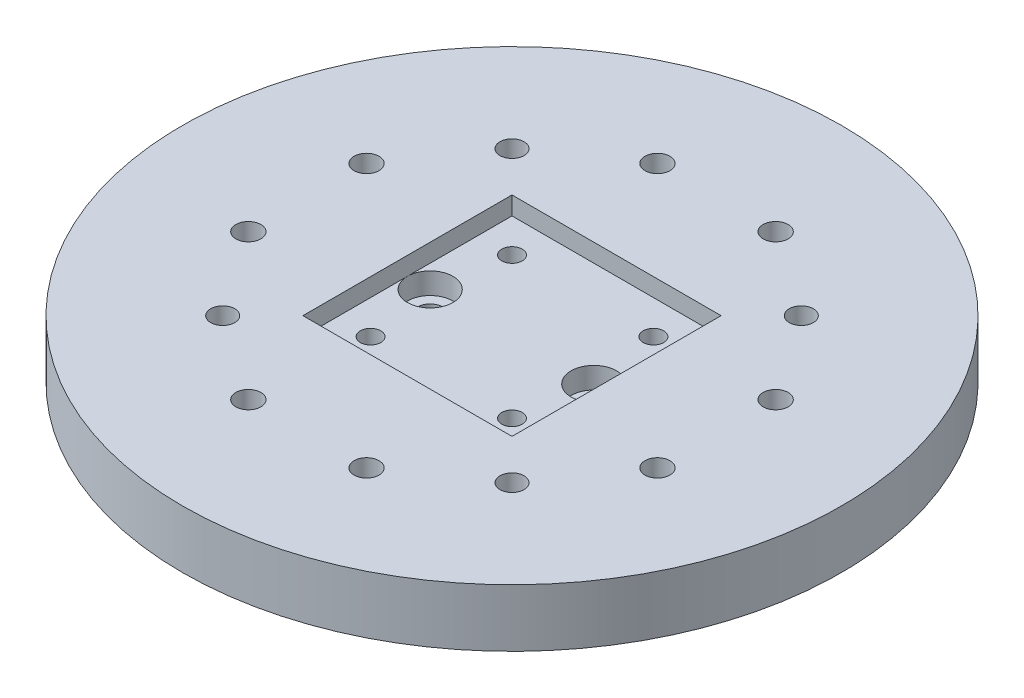
ISO-10303-21;
HEADER;
FILE_DESCRIPTION(('STEP AP214'),'2;1');
FILE_NAME('part.step','',(''),(''),'','','');
FILE_SCHEMA(('AUTOMOTIVE_DESIGN { 1 0 10303 214 1 1 1 1 }'));
ENDSEC;
DATA;
#1=APPLICATION_CONTEXT('core data for automotive mechanical design processes');
#2=APPLICATION_PROTOCOL_DEFINITION('international standard','automotive_design',2000,#1);
#3=PRODUCT_CONTEXT('',#1,'mechanical');
#4=PRODUCT('Part','Part','',(#3));
#5=PRODUCT_RELATED_PRODUCT_CATEGORY('part','',(#4));
#6=PRODUCT_DEFINITION_FORMATION('','',#4);
#7=PRODUCT_DEFINITION_CONTEXT('part definition',#1,'design');
#8=PRODUCT_DEFINITION('design','',#6,#7);
#9=PRODUCT_DEFINITION_SHAPE('','',#8);
#10=(LENGTH_UNIT() NAMED_UNIT(*) SI_UNIT(.MILLI.,.METRE.));
#11=(NAMED_UNIT(*) PLANE_ANGLE_UNIT() SI_UNIT($,.RADIAN.));
#12=(NAMED_UNIT(*) SI_UNIT($,.STERADIAN.) SOLID_ANGLE_UNIT());
#13=UNCERTAINTY_MEASURE_WITH_UNIT(LENGTH_MEASURE(1.E-05),#10,'distance_accuracy_value','');
#14=(GEOMETRIC_REPRESENTATION_CONTEXT(3) GLOBAL_UNCERTAINTY_ASSIGNED_CONTEXT((#13)) GLOBAL_UNIT_ASSIGNED_CONTEXT((#10,
#11,#12)) REPRESENTATION_CONTEXT('',''));
#15=CARTESIAN_POINT('',(0.,0.,0.));
#16=DIRECTION('',(0.,0.,1.));
#17=DIRECTION('',(1.,0.,0.));
#18=AXIS2_PLACEMENT_3D('',#15,#16,#17);
#19=CARTESIAN_POINT('',(-18.,12.7,0.));
#20=DIRECTION('',(0.,-1.,0.));
#21=DIRECTION('',(0.,0.,-1.));
#22=AXIS2_PLACEMENT_3D('',#19,#20,#21);
#23=CYLINDRICAL_SURFACE('',#22,2.75);
#24=CARTESIAN_POINT('',(-18.,0.,0.));
#25=DIRECTION('',(0.,-1.,0.));
#26=DIRECTION('',(0.,0.,1.));
#27=AXIS2_PLACEMENT_3D('',#24,#25,#26);
#28=CIRCLE('',#27,2.75);
#29=CARTESIAN_POINT('',(-18.,0.,2.75));
#30=VERTEX_POINT('',#29);
#31=EDGE_CURVE('E242',#30,#30,#28,.T.);
#32=ORIENTED_EDGE('',*,*,#31,.T.);
#33=EDGE_LOOP('',(#32));
#34=FACE_BOUND('',#33,.T.);
#35=CARTESIAN_POINT('',(-18.,4.,0.));
#36=DIRECTION('',(0.,1.,0.));
#37=DIRECTION('',(0.,0.,1.));
#38=AXIS2_PLACEMENT_3D('',#35,#36,#37);
#39=CIRCLE('',#38,2.75);
#40=CARTESIAN_POINT('',(-18.,4.,2.75));
#41=VERTEX_POINT('',#40);
#42=EDGE_CURVE('E49',#41,#41,#39,.F.);
#43=ORIENTED_EDGE('',*,*,#42,.F.);
#44=EDGE_LOOP('',(#43));
#45=FACE_BOUND('',#44,.T.);
#46=ADVANCED_FACE('F45',(#34,#45),#23,.F.);
#47=CARTESIAN_POINT('',(18.,12.7,0.));
#48=DIRECTION('',(0.,-1.,0.));
#49=DIRECTION('',(0.,0.,-1.));
#50=AXIS2_PLACEMENT_3D('',#47,#48,#49);
#51=CYLINDRICAL_SURFACE('',#50,2.75);
#52=CARTESIAN_POINT('',(18.,0.,0.));
#53=DIRECTION('',(0.,-1.,0.));
#54=DIRECTION('',(0.,0.,-1.));
#55=AXIS2_PLACEMENT_3D('',#52,#53,#54);
#56=CIRCLE('',#55,2.75);
#57=CARTESIAN_POINT('',(18.,0.,-2.75));
#58=VERTEX_POINT('',#57);
#59=EDGE_CURVE('E253',#58,#58,#56,.T.);
#60=ORIENTED_EDGE('',*,*,#59,.T.);
#61=EDGE_LOOP('',(#60));
#62=FACE_BOUND('',#61,.T.);
#63=CARTESIAN_POINT('',(18.,4.,0.));
#64=DIRECTION('',(0.,1.,0.));
#65=DIRECTION('',(0.,0.,1.));
#66=AXIS2_PLACEMENT_3D('',#63,#64,#65);
#67=CIRCLE('',#66,2.75);
#68=CARTESIAN_POINT('',(18.,4.,2.75));
#69=VERTEX_POINT('',#68);
#70=EDGE_CURVE('E236',#69,#69,#67,.F.);
#71=ORIENTED_EDGE('',*,*,#70,.F.);
#72=EDGE_LOOP('',(#71));
#73=FACE_BOUND('',#72,.T.);
#74=ADVANCED_FACE('F299',(#62,#73),#51,.F.);
#75=CARTESIAN_POINT('',(31.8198051533945,12.7,31.8198051533948));
#76=DIRECTION('',(0.,-1.,0.));
#77=DIRECTION('',(0.,0.,-1.));
#78=AXIS2_PLACEMENT_3D('',#75,#76,#77);
#79=CYLINDRICAL_SURFACE('',#78,2.65);
#80=CARTESIAN_POINT('',(31.8198051533945,12.7,31.8198051533948));
#81=DIRECTION('',(0.,-1.,0.));
#82=DIRECTION('',(0.,0.,-1.));
#83=AXIS2_PLACEMENT_3D('',#80,#81,#82);
#84=CIRCLE('',#83,2.65);
#85=CARTESIAN_POINT('',(31.8198051533945,12.7,29.1698051533948));
#86=VERTEX_POINT('',#85);
#87=EDGE_CURVE('E215',#86,#86,#84,.T.);
#88=ORIENTED_EDGE('',*,*,#87,.F.);
#89=EDGE_LOOP('',(#88));
#90=FACE_BOUND('',#89,.T.);
#91=CARTESIAN_POINT('',(31.8198051533945,5.,31.8198051533948));
#92=DIRECTION('',(0.,-1.,0.));
#93=DIRECTION('',(0.,0.,-1.));
#94=AXIS2_PLACEMENT_3D('',#91,#92,#93);
#95=CIRCLE('',#94,2.65);
#96=CARTESIAN_POINT('',(31.8198051533945,5.,29.1698051533948));
#97=VERTEX_POINT('',#96);
#98=EDGE_CURVE('E222',#97,#97,#95,.F.);
#99=ORIENTED_EDGE('',*,*,#98,.F.);
#100=EDGE_LOOP('',(#99));
#101=FACE_BOUND('',#100,.T.);
#102=ADVANCED_FACE('F305',(#90,#101),#79,.F.);
#103=CARTESIAN_POINT('',(31.8198051533948,12.7,-31.8198051533944));
#104=DIRECTION('',(0.,-1.,0.));
#105=DIRECTION('',(0.,0.,-1.));
#106=AXIS2_PLACEMENT_3D('',#103,#104,#105);
#107=CYLINDRICAL_SURFACE('',#106,2.65000000000009);
#108=CARTESIAN_POINT('',(31.8198051533948,12.7,-31.8198051533944));
#109=DIRECTION('',(0.,-1.,0.));
#110=DIRECTION('',(0.,0.,-1.));
#111=AXIS2_PLACEMENT_3D('',#108,#109,#110);
#112=CIRCLE('',#111,2.65000000000009);
#113=CARTESIAN_POINT('',(31.8198051533948,12.7,-34.4698051533945));
#114=VERTEX_POINT('',#113);
#115=EDGE_CURVE('E212',#114,#114,#112,.T.);
#116=ORIENTED_EDGE('',*,*,#115,.F.);
#117=EDGE_LOOP('',(#116));
#118=FACE_BOUND('',#117,.T.);
#119=CARTESIAN_POINT('',(31.8198051533948,5.,-31.8198051533944));
#120=DIRECTION('',(0.,-1.,0.));
#121=DIRECTION('',(0.,0.,-1.));
#122=AXIS2_PLACEMENT_3D('',#119,#120,#121);
#123=CIRCLE('',#122,2.65000000000009);
#124=CARTESIAN_POINT('',(31.8198051533948,5.,-34.4698051533945));
#125=VERTEX_POINT('',#124);
#126=EDGE_CURVE('E232',#125,#125,#123,.F.);
#127=ORIENTED_EDGE('',*,*,#126,.F.);
#128=EDGE_LOOP('',(#127));
#129=FACE_BOUND('',#128,.T.);
#130=ADVANCED_FACE('F384',(#118,#129),#107,.F.);
#131=CARTESIAN_POINT('',(-31.8198051533945,12.7,-31.8198051533948));
#132=DIRECTION('',(0.,-1.,0.));
#133=DIRECTION('',(0.,0.,-1.));
#134=AXIS2_PLACEMENT_3D('',#131,#132,#133);
#135=CYLINDRICAL_SURFACE('',#134,2.65000000000017);
#136=CARTESIAN_POINT('',(-31.8198051533945,12.7,-31.8198051533948));
#137=DIRECTION('',(0.,-1.,0.));
#138=DIRECTION('',(0.,0.,-1.));
#139=AXIS2_PLACEMENT_3D('',#136,#137,#138);
#140=CIRCLE('',#139,2.65000000000017);
#141=CARTESIAN_POINT('',(-31.8198051533945,12.7,-34.469805153395));
#142=VERTEX_POINT('',#141);
#143=EDGE_CURVE('E216',#142,#142,#140,.T.);
#144=ORIENTED_EDGE('',*,*,#143,.F.);
#145=EDGE_LOOP('',(#144));
#146=FACE_BOUND('',#145,.T.);
#147=CARTESIAN_POINT('',(-31.8198051533945,5.,-31.8198051533948));
#148=DIRECTION('',(0.,-1.,0.));
#149=DIRECTION('',(0.,0.,-1.));
#150=AXIS2_PLACEMENT_3D('',#147,#148,#149);
#151=CIRCLE('',#150,2.65000000000017);
#152=CARTESIAN_POINT('',(-31.8198051533945,5.,-34.469805153395));
#153=VERTEX_POINT('',#152);
#154=EDGE_CURVE('E229',#153,#153,#151,.F.);
#155=ORIENTED_EDGE('',*,*,#154,.F.);
#156=EDGE_LOOP('',(#155));
#157=FACE_BOUND('',#156,.T.);
#158=ADVANCED_FACE('F376',(#146,#157),#135,.F.);
#159=CARTESIAN_POINT('',(-31.8198051533948,12.7,31.8198051533945));
#160=DIRECTION('',(0.,-1.,0.));
#161=DIRECTION('',(0.,0.,-1.));
#162=AXIS2_PLACEMENT_3D('',#159,#160,#161);
#163=CYLINDRICAL_SURFACE('',#162,2.65000000000026);
#164=CARTESIAN_POINT('',(-31.8198051533948,12.7,31.8198051533945));
#165=DIRECTION('',(0.,-1.,0.));
#166=DIRECTION('',(0.,0.,-1.));
#167=AXIS2_PLACEMENT_3D('',#164,#165,#166);
#168=CIRCLE('',#167,2.65000000000026);
#169=CARTESIAN_POINT('',(-31.8198051533948,12.7,29.1698051533942));
#170=VERTEX_POINT('',#169);
#171=EDGE_CURVE('E219',#170,#170,#168,.T.);
#172=ORIENTED_EDGE('',*,*,#171,.F.);
#173=EDGE_LOOP('',(#172));
#174=FACE_BOUND('',#173,.T.);
#175=CARTESIAN_POINT('',(-31.8198051533948,5.,31.8198051533945));
#176=DIRECTION('',(0.,-1.,0.));
#177=DIRECTION('',(0.,0.,-1.));
#178=AXIS2_PLACEMENT_3D('',#175,#176,#177);
#179=CIRCLE('',#178,2.65000000000026);
#180=CARTESIAN_POINT('',(-31.8198051533948,5.,29.1698051533942));
#181=VERTEX_POINT('',#180);
#182=EDGE_CURVE('E209',#181,#181,#179,.F.);
#183=ORIENTED_EDGE('',*,*,#182,.F.);
#184=EDGE_LOOP('',(#183));
#185=FACE_BOUND('',#184,.T.);
#186=ADVANCED_FACE('F368',(#174,#185),#163,.F.);
#187=CARTESIAN_POINT('',(0.,12.7,0.));
#188=DIRECTION('',(0.,-1.,0.));
#189=DIRECTION('',(0.,0.,-1.));
#190=AXIS2_PLACEMENT_3D('',#187,#188,#189);
#191=CYLINDRICAL_SURFACE('',#190,72.5);
#192=CARTESIAN_POINT('',(0.,12.7,0.));
#193=DIRECTION('',(0.,1.,0.));
#194=DIRECTION('',(0.,0.,1.));
#195=AXIS2_PLACEMENT_3D('',#192,#193,#194);
#196=CIRCLE('',#195,72.5);
#197=CARTESIAN_POINT('',(0.,12.7,72.5));
#198=VERTEX_POINT('',#197);
#199=EDGE_CURVE('E12',#198,#198,#196,.T.);
#200=ORIENTED_EDGE('',*,*,#199,.F.);
#201=EDGE_LOOP('',(#200));
#202=FACE_BOUND('',#201,.T.);
#203=CARTESIAN_POINT('',(0.,0.,0.));
#204=DIRECTION('',(0.,1.,0.));
#205=DIRECTION('',(0.,0.,1.));
#206=AXIS2_PLACEMENT_3D('',#203,#204,#205);
#207=CIRCLE('',#206,72.5);
#208=CARTESIAN_POINT('',(0.,0.,72.5));
#209=VERTEX_POINT('',#208);
#210=EDGE_CURVE('E54',#209,#209,#207,.T.);
#211=ORIENTED_EDGE('',*,*,#210,.T.);
#212=EDGE_LOOP('',(#211));
#213=FACE_BOUND('',#212,.T.);
#214=ADVANCED_FACE('F47',(#202,#213),#191,.T.);
#215=CARTESIAN_POINT('',(0.,12.7,0.));
#216=DIRECTION('',(0.,1.,0.));
#217=DIRECTION('',(0.,0.,1.));
#218=AXIS2_PLACEMENT_3D('',#215,#216,#217);
#219=PLANE('',#218);
#220=DIRECTION('',(0.,0.,-1.));
#221=VECTOR('',#220,1.);
#222=CARTESIAN_POINT('',(23.,12.7,-23.));
#223=LINE('',#222,#221);
#224=CARTESIAN_POINT('',(23.,12.7,23.));
#225=VERTEX_POINT('',#224);
#226=CARTESIAN_POINT('',(23.,12.7,-23.));
#227=VERTEX_POINT('',#226);
#228=EDGE_CURVE('E108',#225,#227,#223,.T.);
#229=ORIENTED_EDGE('',*,*,#228,.F.);
#230=DIRECTION('',(1.,0.,0.));
#231=VECTOR('',#230,1.);
#232=CARTESIAN_POINT('',(-23.,12.7,23.));
#233=LINE('',#232,#231);
#234=CARTESIAN_POINT('',(-23.,12.7,23.));
#235=VERTEX_POINT('',#234);
#236=EDGE_CURVE('E102',#235,#225,#233,.T.);
#237=ORIENTED_EDGE('',*,*,#236,.F.);
#238=DIRECTION('',(0.,0.,1.));
#239=VECTOR('',#238,1.);
#240=CARTESIAN_POINT('',(-23.,12.7,-23.));
#241=LINE('',#240,#239);
#242=CARTESIAN_POINT('',(-23.,12.7,-23.));
#243=VERTEX_POINT('',#242);
#244=EDGE_CURVE('E129',#243,#235,#241,.T.);
#245=ORIENTED_EDGE('',*,*,#244,.F.);
#246=DIRECTION('',(-1.,0.,0.));
#247=VECTOR('',#246,1.);
#248=CARTESIAN_POINT('',(-23.,12.7,-23.));
#249=LINE('',#248,#247);
#250=EDGE_CURVE('E126',#227,#243,#249,.T.);
#251=ORIENTED_EDGE('',*,*,#250,.F.);
#252=EDGE_LOOP('',(#229,#237,#245,#251));
#253=FACE_BOUND('',#252,.T.);
#254=CARTESIAN_POINT('',(-13.,12.7,-45.));
#255=DIRECTION('',(0.,-1.,0.));
#256=DIRECTION('',(0.,0.,-1.));
#257=AXIS2_PLACEMENT_3D('',#254,#255,#256);
#258=CIRCLE('',#257,2.74999999999984);
#259=CARTESIAN_POINT('',(-13.,12.7,-47.7499999999998));
#260=VERTEX_POINT('',#259);
#261=EDGE_CURVE('E165',#260,#260,#258,.T.);
#262=ORIENTED_EDGE('',*,*,#261,.T.);
#263=EDGE_LOOP('',(#262));
#264=FACE_BOUND('',#263,.T.);
#265=CARTESIAN_POINT('',(45.,12.7,13.));
#266=DIRECTION('',(0.,-1.,0.));
#267=DIRECTION('',(0.,0.,1.));
#268=AXIS2_PLACEMENT_3D('',#265,#266,#267);
#269=CIRCLE('',#268,2.75);
#270=CARTESIAN_POINT('',(45.,12.7,15.75));
#271=VERTEX_POINT('',#270);
#272=EDGE_CURVE('E158',#271,#271,#269,.T.);
#273=ORIENTED_EDGE('',*,*,#272,.T.);
#274=EDGE_LOOP('',(#273));
#275=FACE_BOUND('',#274,.T.);
#276=CARTESIAN_POINT('',(45.,12.7,-13.));
#277=DIRECTION('',(0.,-1.,0.));
#278=DIRECTION('',(0.,0.,-1.));
#279=AXIS2_PLACEMENT_3D('',#276,#277,#278);
#280=CIRCLE('',#279,2.75);
#281=CARTESIAN_POINT('',(45.,12.7,-15.75));
#282=VERTEX_POINT('',#281);
#283=EDGE_CURVE('E177',#282,#282,#280,.T.);
#284=ORIENTED_EDGE('',*,*,#283,.T.);
#285=EDGE_LOOP('',(#284));
#286=FACE_BOUND('',#285,.T.);
#287=CARTESIAN_POINT('',(-13.,12.7,45.));
#288=DIRECTION('',(0.,-1.,0.));
#289=DIRECTION('',(0.,0.,1.));
#290=AXIS2_PLACEMENT_3D('',#287,#288,#289);
#291=CIRCLE('',#290,2.75);
#292=CARTESIAN_POINT('',(-13.,12.7,47.75));
#293=VERTEX_POINT('',#292);
#294=EDGE_CURVE('E170',#293,#293,#291,.T.);
#295=ORIENTED_EDGE('',*,*,#294,.T.);
#296=EDGE_LOOP('',(#295));
#297=FACE_BOUND('',#296,.T.);
#298=CARTESIAN_POINT('',(-45.,12.7,-13.));
#299=DIRECTION('',(0.,-1.,0.));
#300=DIRECTION('',(0.,0.,1.));
#301=AXIS2_PLACEMENT_3D('',#298,#299,#300);
#302=CIRCLE('',#301,2.75);
#303=CARTESIAN_POINT('',(-45.,12.7,-10.25));
#304=VERTEX_POINT('',#303);
#305=EDGE_CURVE('E140',#304,#304,#302,.T.);
#306=ORIENTED_EDGE('',*,*,#305,.T.);
#307=EDGE_LOOP('',(#306));
#308=FACE_BOUND('',#307,.T.);
#309=CARTESIAN_POINT('',(-45.,12.7,13.));
#310=DIRECTION('',(0.,-1.,0.));
#311=DIRECTION('',(0.,0.,-1.));
#312=AXIS2_PLACEMENT_3D('',#309,#310,#311);
#313=CIRCLE('',#312,2.75);
#314=CARTESIAN_POINT('',(-45.,12.7,10.25));
#315=VERTEX_POINT('',#314);
#316=EDGE_CURVE('E153',#315,#315,#313,.T.);
#317=ORIENTED_EDGE('',*,*,#316,.T.);
#318=EDGE_LOOP('',(#317));
#319=FACE_BOUND('',#318,.T.);
#320=CARTESIAN_POINT('',(13.,12.7,-45.));
#321=DIRECTION('',(0.,-1.,0.));
#322=DIRECTION('',(0.,0.,1.));
#323=AXIS2_PLACEMENT_3D('',#320,#321,#322);
#324=CIRCLE('',#323,2.75);
#325=CARTESIAN_POINT('',(13.,12.7,-42.25));
#326=VERTEX_POINT('',#325);
#327=EDGE_CURVE('E146',#326,#326,#324,.T.);
#328=ORIENTED_EDGE('',*,*,#327,.T.);
#329=EDGE_LOOP('',(#328));
#330=FACE_BOUND('',#329,.T.);
#331=CARTESIAN_POINT('',(13.,12.7,45.));
#332=DIRECTION('',(0.,-1.,0.));
#333=DIRECTION('',(0.,0.,-1.));
#334=AXIS2_PLACEMENT_3D('',#331,#332,#333);
#335=CIRCLE('',#334,2.75);
#336=CARTESIAN_POINT('',(13.,12.7,42.25));
#337=VERTEX_POINT('',#336);
#338=EDGE_CURVE('E182',#337,#337,#335,.T.);
#339=ORIENTED_EDGE('',*,*,#338,.T.);
#340=EDGE_LOOP('',(#339));
#341=FACE_BOUND('',#340,.T.);
#342=ORIENTED_EDGE('',*,*,#171,.T.);
#343=EDGE_LOOP('',(#342));
#344=FACE_BOUND('',#343,.T.);
#345=ORIENTED_EDGE('',*,*,#143,.T.);
#346=EDGE_LOOP('',(#345));
#347=FACE_BOUND('',#346,.T.);
#348=ORIENTED_EDGE('',*,*,#115,.T.);
#349=EDGE_LOOP('',(#348));
#350=FACE_BOUND('',#349,.T.);
#351=ORIENTED_EDGE('',*,*,#87,.T.);
#352=EDGE_LOOP('',(#351));
#353=FACE_BOUND('',#352,.T.);
#354=ORIENTED_EDGE('',*,*,#199,.T.);
#355=EDGE_LOOP('',(#354));
#356=FACE_BOUND('',#355,.T.);
#357=ADVANCED_FACE('F335',(#253,#264,#275,#286,#297,#308,#319,#330,#341,#344,#347,#350,#353,
#356),#219,.T.);
#358=CARTESIAN_POINT('',(0.,0.,0.));
#359=DIRECTION('',(0.,1.,0.));
#360=DIRECTION('',(0.,0.,1.));
#361=AXIS2_PLACEMENT_3D('',#358,#359,#360);
#362=PLANE('',#361);
#363=ORIENTED_EDGE('',*,*,#59,.F.);
#364=EDGE_LOOP('',(#363));
#365=FACE_BOUND('',#364,.T.);
#366=ORIENTED_EDGE('',*,*,#31,.F.);
#367=EDGE_LOOP('',(#366));
#368=FACE_BOUND('',#367,.T.);
#369=CARTESIAN_POINT('',(-15.556349186104,0.,-15.5563491861041));
#370=DIRECTION('',(0.,1.,0.));
#371=DIRECTION('',(0.,0.,-1.));
#372=AXIS2_PLACEMENT_3D('',#369,#370,#371);
#373=CIRCLE('',#372,2.25);
#374=CARTESIAN_POINT('',(-15.556349186104,0.,-17.8063491861041));
#375=VERTEX_POINT('',#374);
#376=EDGE_CURVE('E265',#375,#375,#373,.T.);
#377=ORIENTED_EDGE('',*,*,#376,.T.);
#378=EDGE_LOOP('',(#377));
#379=FACE_BOUND('',#378,.T.);
#380=CARTESIAN_POINT('',(15.556349186104,0.,15.5563491861041));
#381=DIRECTION('',(0.,1.,0.));
#382=DIRECTION('',(0.,0.,-1.));
#383=AXIS2_PLACEMENT_3D('',#380,#381,#382);
#384=CIRCLE('',#383,2.25);
#385=CARTESIAN_POINT('',(15.556349186104,0.,13.3063491861041));
#386=VERTEX_POINT('',#385);
#387=EDGE_CURVE('E272',#386,#386,#384,.T.);
#388=ORIENTED_EDGE('',*,*,#387,.T.);
#389=EDGE_LOOP('',(#388));
#390=FACE_BOUND('',#389,.T.);
#391=CARTESIAN_POINT('',(-15.556349186104,0.,15.5563491861041));
#392=DIRECTION('',(0.,1.,0.));
#393=DIRECTION('',(0.,0.,1.));
#394=AXIS2_PLACEMENT_3D('',#391,#392,#393);
#395=CIRCLE('',#394,2.25);
#396=CARTESIAN_POINT('',(-15.556349186104,0.,17.8063491861041));
#397=VERTEX_POINT('',#396);
#398=EDGE_CURVE('E259',#397,#397,#395,.T.);
#399=ORIENTED_EDGE('',*,*,#398,.T.);
#400=EDGE_LOOP('',(#399));
#401=FACE_BOUND('',#400,.T.);
#402=CARTESIAN_POINT('',(15.556349186104,0.,-15.5563491861041));
#403=DIRECTION('',(0.,1.,0.));
#404=DIRECTION('',(0.,0.,1.));
#405=AXIS2_PLACEMENT_3D('',#402,#403,#404);
#406=CIRCLE('',#405,2.25);
#407=CARTESIAN_POINT('',(15.556349186104,0.,-13.3063491861041));
#408=VERTEX_POINT('',#407);
#409=EDGE_CURVE('E127',#408,#408,#406,.T.);
#410=ORIENTED_EDGE('',*,*,#409,.T.);
#411=EDGE_LOOP('',(#410));
#412=FACE_BOUND('',#411,.T.);
#413=CARTESIAN_POINT('',(-13.,0.,-45.));
#414=DIRECTION('',(0.,-1.,0.));
#415=DIRECTION('',(0.,0.,-1.));
#416=AXIS2_PLACEMENT_3D('',#413,#414,#415);
#417=CIRCLE('',#416,2.74999999999984);
#418=CARTESIAN_POINT('',(-13.,0.,-47.7499999999998));
#419=VERTEX_POINT('',#418);
#420=EDGE_CURVE('E149',#419,#419,#417,.T.);
#421=ORIENTED_EDGE('',*,*,#420,.F.);
#422=EDGE_LOOP('',(#421));
#423=FACE_BOUND('',#422,.T.);
#424=CARTESIAN_POINT('',(45.,0.,13.));
#425=DIRECTION('',(0.,-1.,0.));
#426=DIRECTION('',(0.,0.,1.));
#427=AXIS2_PLACEMENT_3D('',#424,#425,#426);
#428=CIRCLE('',#427,2.75);
#429=CARTESIAN_POINT('',(45.,0.,15.75));
#430=VERTEX_POINT('',#429);
#431=EDGE_CURVE('E162',#430,#430,#428,.T.);
#432=ORIENTED_EDGE('',*,*,#431,.F.);
#433=EDGE_LOOP('',(#432));
#434=FACE_BOUND('',#433,.T.);
#435=CARTESIAN_POINT('',(45.,0.,-13.));
#436=DIRECTION('',(0.,-1.,0.));
#437=DIRECTION('',(0.,0.,-1.));
#438=AXIS2_PLACEMENT_3D('',#435,#436,#437);
#439=CIRCLE('',#438,2.75);
#440=CARTESIAN_POINT('',(45.,0.,-15.75));
#441=VERTEX_POINT('',#440);
#442=EDGE_CURVE('E161',#441,#441,#439,.T.);
#443=ORIENTED_EDGE('',*,*,#442,.F.);
#444=EDGE_LOOP('',(#443));
#445=FACE_BOUND('',#444,.T.);
#446=CARTESIAN_POINT('',(-13.,0.,45.));
#447=DIRECTION('',(0.,-1.,0.));
#448=DIRECTION('',(0.,0.,1.));
#449=AXIS2_PLACEMENT_3D('',#446,#447,#448);
#450=CIRCLE('',#449,2.75);
#451=CARTESIAN_POINT('',(-13.,0.,47.75));
#452=VERTEX_POINT('',#451);
#453=EDGE_CURVE('E174',#452,#452,#450,.T.);
#454=ORIENTED_EDGE('',*,*,#453,.F.);
#455=EDGE_LOOP('',(#454));
#456=FACE_BOUND('',#455,.T.);
#457=CARTESIAN_POINT('',(-45.,0.,-13.));
#458=DIRECTION('',(0.,-1.,0.));
#459=DIRECTION('',(0.,0.,1.));
#460=AXIS2_PLACEMENT_3D('',#457,#458,#459);
#461=CIRCLE('',#460,2.75);
#462=CARTESIAN_POINT('',(-45.,0.,-10.25));
#463=VERTEX_POINT('',#462);
#464=EDGE_CURVE('E136',#463,#463,#461,.T.);
#465=ORIENTED_EDGE('',*,*,#464,.F.);
#466=EDGE_LOOP('',(#465));
#467=FACE_BOUND('',#466,.T.);
#468=CARTESIAN_POINT('',(-45.,0.,13.));
#469=DIRECTION('',(0.,-1.,0.));
#470=DIRECTION('',(0.,0.,-1.));
#471=AXIS2_PLACEMENT_3D('',#468,#469,#470);
#472=CIRCLE('',#471,2.75);
#473=CARTESIAN_POINT('',(-45.,0.,10.25));
#474=VERTEX_POINT('',#473);
#475=EDGE_CURVE('E143',#474,#474,#472,.T.);
#476=ORIENTED_EDGE('',*,*,#475,.F.);
#477=EDGE_LOOP('',(#476));
#478=FACE_BOUND('',#477,.T.);
#479=CARTESIAN_POINT('',(13.,0.,-45.));
#480=DIRECTION('',(0.,-1.,0.));
#481=DIRECTION('',(0.,0.,1.));
#482=AXIS2_PLACEMENT_3D('',#479,#480,#481);
#483=CIRCLE('',#482,2.75);
#484=CARTESIAN_POINT('',(13.,0.,-42.25));
#485=VERTEX_POINT('',#484);
#486=EDGE_CURVE('E150',#485,#485,#483,.T.);
#487=ORIENTED_EDGE('',*,*,#486,.F.);
#488=EDGE_LOOP('',(#487));
#489=FACE_BOUND('',#488,.T.);
#490=CARTESIAN_POINT('',(13.,0.,45.));
#491=DIRECTION('',(0.,-1.,0.));
#492=DIRECTION('',(0.,0.,-1.));
#493=AXIS2_PLACEMENT_3D('',#490,#491,#492);
#494=CIRCLE('',#493,2.75);
#495=CARTESIAN_POINT('',(13.,0.,42.25));
#496=VERTEX_POINT('',#495);
#497=EDGE_CURVE('E173',#496,#496,#494,.T.);
#498=ORIENTED_EDGE('',*,*,#497,.F.);
#499=EDGE_LOOP('',(#498));
#500=FACE_BOUND('',#499,.T.);
#501=CARTESIAN_POINT('',(-31.8198051533944,0.,-31.8198051533948));
#502=DIRECTION('',(0.,-1.,0.));
#503=DIRECTION('',(0.,0.,-1.));
#504=AXIS2_PLACEMENT_3D('',#501,#502,#503);
#505=CIRCLE('',#504,5.);
#506=CARTESIAN_POINT('',(-31.8198051533944,0.,-36.8198051533948));
#507=VERTEX_POINT('',#506);
#508=EDGE_CURVE('E185',#507,#507,#505,.T.);
#509=ORIENTED_EDGE('',*,*,#508,.F.);
#510=EDGE_LOOP('',(#509));
#511=FACE_BOUND('',#510,.T.);
#512=CARTESIAN_POINT('',(31.8198051533948,0.,-31.8198051533944));
#513=DIRECTION('',(0.,-1.,0.));
#514=DIRECTION('',(0.,0.,-1.));
#515=AXIS2_PLACEMENT_3D('',#512,#513,#514);
#516=CIRCLE('',#515,5.);
#517=CARTESIAN_POINT('',(31.8198051533948,0.,-36.8198051533944));
#518=VERTEX_POINT('',#517);
#519=EDGE_CURVE('E198',#518,#518,#516,.T.);
#520=ORIENTED_EDGE('',*,*,#519,.F.);
#521=EDGE_LOOP('',(#520));
#522=FACE_BOUND('',#521,.T.);
#523=CARTESIAN_POINT('',(31.8198051533944,0.,31.8198051533948));
#524=DIRECTION('',(0.,-1.,0.));
#525=DIRECTION('',(0.,0.,-1.));
#526=AXIS2_PLACEMENT_3D('',#523,#524,#525);
#527=CIRCLE('',#526,5.);
#528=CARTESIAN_POINT('',(31.8198051533944,0.,26.8198051533948));
#529=VERTEX_POINT('',#528);
#530=EDGE_CURVE('E192',#529,#529,#527,.T.);
#531=ORIENTED_EDGE('',*,*,#530,.F.);
#532=EDGE_LOOP('',(#531));
#533=FACE_BOUND('',#532,.T.);
#534=CARTESIAN_POINT('',(-31.8198051533948,0.,31.8198051533945));
#535=DIRECTION('',(0.,-1.,0.));
#536=DIRECTION('',(0.,0.,-1.));
#537=AXIS2_PLACEMENT_3D('',#534,#535,#536);
#538=CIRCLE('',#537,5.);
#539=CARTESIAN_POINT('',(-31.8198051533948,0.,26.8198051533945));
#540=VERTEX_POINT('',#539);
#541=EDGE_CURVE('E191',#540,#540,#538,.T.);
#542=ORIENTED_EDGE('',*,*,#541,.F.);
#543=EDGE_LOOP('',(#542));
#544=FACE_BOUND('',#543,.T.);
#545=ORIENTED_EDGE('',*,*,#210,.F.);
#546=EDGE_LOOP('',(#545));
#547=FACE_BOUND('',#546,.T.);
#548=ADVANCED_FACE('F331',(#365,#368,#379,#390,#401,#412,#423,#434,#445,#456,#467,#478,#489,
#500,#511,#522,#533,#544,#547),#362,.F.);
#549=CARTESIAN_POINT('',(-31.8198051533948,5.,31.8198051533945));
#550=DIRECTION('',(0.,-1.,0.));
#551=DIRECTION('',(0.,0.,-1.));
#552=AXIS2_PLACEMENT_3D('',#549,#550,#551);
#553=PLANE('',#552);
#554=CARTESIAN_POINT('',(-31.8198051533948,5.,31.8198051533945));
#555=DIRECTION('',(0.,-1.,0.));
#556=DIRECTION('',(0.,0.,-1.));
#557=AXIS2_PLACEMENT_3D('',#554,#555,#556);
#558=CIRCLE('',#557,5.);
#559=CARTESIAN_POINT('',(-31.8198051533948,5.,26.8198051533945));
#560=VERTEX_POINT('',#559);
#561=EDGE_CURVE('E206',#560,#560,#558,.T.);
#562=ORIENTED_EDGE('',*,*,#561,.T.);
#563=EDGE_LOOP('',(#562));
#564=FACE_BOUND('',#563,.T.);
#565=ORIENTED_EDGE('',*,*,#182,.T.);
#566=EDGE_LOOP('',(#565));
#567=FACE_BOUND('',#566,.T.);
#568=ADVANCED_FACE('F334',(#564,#567),#553,.T.);
#569=CARTESIAN_POINT('',(-31.8198051533948,5.,31.8198051533945));
#570=DIRECTION('',(0.,-1.,0.));
#571=DIRECTION('',(0.,0.,-1.));
#572=AXIS2_PLACEMENT_3D('',#569,#570,#571);
#573=CYLINDRICAL_SURFACE('',#572,5.);
#574=ORIENTED_EDGE('',*,*,#561,.F.);
#575=EDGE_LOOP('',(#574));
#576=FACE_BOUND('',#575,.T.);
#577=ORIENTED_EDGE('',*,*,#541,.T.);
#578=EDGE_LOOP('',(#577));
#579=FACE_BOUND('',#578,.T.);
#580=ADVANCED_FACE('F427',(#576,#579),#573,.F.);
#581=CARTESIAN_POINT('',(-31.8198051533944,5.,-31.8198051533948));
#582=DIRECTION('',(0.,-1.,0.));
#583=DIRECTION('',(0.,0.,-1.));
#584=AXIS2_PLACEMENT_3D('',#581,#582,#583);
#585=PLANE('',#584);
#586=CARTESIAN_POINT('',(-31.8198051533944,5.,-31.8198051533948));
#587=DIRECTION('',(0.,-1.,0.));
#588=DIRECTION('',(0.,0.,-1.));
#589=AXIS2_PLACEMENT_3D('',#586,#587,#588);
#590=CIRCLE('',#589,5.);
#591=CARTESIAN_POINT('',(-31.8198051533944,5.,-36.8198051533948));
#592=VERTEX_POINT('',#591);
#593=EDGE_CURVE('E201',#592,#592,#590,.T.);
#594=ORIENTED_EDGE('',*,*,#593,.T.);
#595=EDGE_LOOP('',(#594));
#596=FACE_BOUND('',#595,.T.);
#597=ORIENTED_EDGE('',*,*,#154,.T.);
#598=EDGE_LOOP('',(#597));
#599=FACE_BOUND('',#598,.T.);
#600=ADVANCED_FACE('F424',(#596,#599),#585,.T.);
#601=CARTESIAN_POINT('',(-31.8198051533944,5.,-31.8198051533948));
#602=DIRECTION('',(0.,-1.,0.));
#603=DIRECTION('',(0.,0.,-1.));
#604=AXIS2_PLACEMENT_3D('',#601,#602,#603);
#605=CYLINDRICAL_SURFACE('',#604,5.);
#606=ORIENTED_EDGE('',*,*,#593,.F.);
#607=EDGE_LOOP('',(#606));
#608=FACE_BOUND('',#607,.T.);
#609=ORIENTED_EDGE('',*,*,#508,.T.);
#610=EDGE_LOOP('',(#609));
#611=FACE_BOUND('',#610,.T.);
#612=ADVANCED_FACE('F421',(#608,#611),#605,.F.);
#613=CARTESIAN_POINT('',(31.8198051533948,5.,-31.8198051533944));
#614=DIRECTION('',(0.,-1.,0.));
#615=DIRECTION('',(0.,0.,-1.));
#616=AXIS2_PLACEMENT_3D('',#613,#614,#615);
#617=PLANE('',#616);
#618=CARTESIAN_POINT('',(31.8198051533948,5.,-31.8198051533944));
#619=DIRECTION('',(0.,-1.,0.));
#620=DIRECTION('',(0.,0.,-1.));
#621=AXIS2_PLACEMENT_3D('',#618,#619,#620);
#622=CIRCLE('',#621,5.);
#623=CARTESIAN_POINT('',(31.8198051533948,5.,-36.8198051533944));
#624=VERTEX_POINT('',#623);
#625=EDGE_CURVE('E195',#624,#624,#622,.T.);
#626=ORIENTED_EDGE('',*,*,#625,.T.);
#627=EDGE_LOOP('',(#626));
#628=FACE_BOUND('',#627,.T.);
#629=ORIENTED_EDGE('',*,*,#126,.T.);
#630=EDGE_LOOP('',(#629));
#631=FACE_BOUND('',#630,.T.);
#632=ADVANCED_FACE('F414',(#628,#631),#617,.T.);
#633=CARTESIAN_POINT('',(31.8198051533948,5.,-31.8198051533944));
#634=DIRECTION('',(0.,-1.,0.));
#635=DIRECTION('',(0.,0.,-1.));
#636=AXIS2_PLACEMENT_3D('',#633,#634,#635);
#637=CYLINDRICAL_SURFACE('',#636,5.);
#638=ORIENTED_EDGE('',*,*,#625,.F.);
#639=EDGE_LOOP('',(#638));
#640=FACE_BOUND('',#639,.T.);
#641=ORIENTED_EDGE('',*,*,#519,.T.);
#642=EDGE_LOOP('',(#641));
#643=FACE_BOUND('',#642,.T.);
#644=ADVANCED_FACE('F404',(#640,#643),#637,.F.);
#645=CARTESIAN_POINT('',(31.8198051533944,5.,31.8198051533948));
#646=DIRECTION('',(0.,-1.,0.));
#647=DIRECTION('',(0.,0.,-1.));
#648=AXIS2_PLACEMENT_3D('',#645,#646,#647);
#649=PLANE('',#648);
#650=CARTESIAN_POINT('',(31.8198051533944,5.,31.8198051533948));
#651=DIRECTION('',(0.,-1.,0.));
#652=DIRECTION('',(0.,0.,-1.));
#653=AXIS2_PLACEMENT_3D('',#650,#651,#652);
#654=CIRCLE('',#653,5.);
#655=CARTESIAN_POINT('',(31.8198051533944,5.,26.8198051533948));
#656=VERTEX_POINT('',#655);
#657=EDGE_CURVE('E188',#656,#656,#654,.T.);
#658=ORIENTED_EDGE('',*,*,#657,.T.);
#659=EDGE_LOOP('',(#658));
#660=FACE_BOUND('',#659,.T.);
#661=ORIENTED_EDGE('',*,*,#98,.T.);
#662=EDGE_LOOP('',(#661));
#663=FACE_BOUND('',#662,.T.);
#664=ADVANCED_FACE('F401',(#660,#663),#649,.T.);
#665=CARTESIAN_POINT('',(31.8198051533944,5.,31.8198051533948));
#666=DIRECTION('',(0.,-1.,0.));
#667=DIRECTION('',(0.,0.,-1.));
#668=AXIS2_PLACEMENT_3D('',#665,#666,#667);
#669=CYLINDRICAL_SURFACE('',#668,5.);
#670=ORIENTED_EDGE('',*,*,#657,.F.);
#671=EDGE_LOOP('',(#670));
#672=FACE_BOUND('',#671,.T.);
#673=ORIENTED_EDGE('',*,*,#530,.T.);
#674=EDGE_LOOP('',(#673));
#675=FACE_BOUND('',#674,.T.);
#676=ADVANCED_FACE('F403',(#672,#675),#669,.F.);
#677=CARTESIAN_POINT('',(13.,12.7,45.));
#678=DIRECTION('',(0.,-1.,0.));
#679=DIRECTION('',(0.,0.,-1.));
#680=AXIS2_PLACEMENT_3D('',#677,#678,#679);
#681=CYLINDRICAL_SURFACE('',#680,2.75);
#682=ORIENTED_EDGE('',*,*,#338,.F.);
#683=EDGE_LOOP('',(#682));
#684=FACE_BOUND('',#683,.T.);
#685=ORIENTED_EDGE('',*,*,#497,.T.);
#686=EDGE_LOOP('',(#685));
#687=FACE_BOUND('',#686,.T.);
#688=ADVANCED_FACE('F411',(#684,#687),#681,.F.);
#689=CARTESIAN_POINT('',(13.,12.7,-45.));
#690=DIRECTION('',(0.,-1.,0.));
#691=DIRECTION('',(0.,0.,-1.));
#692=AXIS2_PLACEMENT_3D('',#689,#690,#691);
#693=CYLINDRICAL_SURFACE('',#692,2.75);
#694=ORIENTED_EDGE('',*,*,#327,.F.);
#695=EDGE_LOOP('',(#694));
#696=FACE_BOUND('',#695,.T.);
#697=ORIENTED_EDGE('',*,*,#486,.T.);
#698=EDGE_LOOP('',(#697));
#699=FACE_BOUND('',#698,.T.);
#700=ADVANCED_FACE('F480',(#696,#699),#693,.F.);
#701=CARTESIAN_POINT('',(-45.,12.7,13.));
#702=DIRECTION('',(0.,-1.,0.));
#703=DIRECTION('',(0.,0.,-1.));
#704=AXIS2_PLACEMENT_3D('',#701,#702,#703);
#705=CYLINDRICAL_SURFACE('',#704,2.75);
#706=ORIENTED_EDGE('',*,*,#316,.F.);
#707=EDGE_LOOP('',(#706));
#708=FACE_BOUND('',#707,.T.);
#709=ORIENTED_EDGE('',*,*,#475,.T.);
#710=EDGE_LOOP('',(#709));
#711=FACE_BOUND('',#710,.T.);
#712=ADVANCED_FACE('F489',(#708,#711),#705,.F.);
#713=CARTESIAN_POINT('',(-45.,12.7,-13.));
#714=DIRECTION('',(0.,-1.,0.));
#715=DIRECTION('',(0.,0.,-1.));
#716=AXIS2_PLACEMENT_3D('',#713,#714,#715);
#717=CYLINDRICAL_SURFACE('',#716,2.75);
#718=ORIENTED_EDGE('',*,*,#305,.F.);
#719=EDGE_LOOP('',(#718));
#720=FACE_BOUND('',#719,.T.);
#721=ORIENTED_EDGE('',*,*,#464,.T.);
#722=EDGE_LOOP('',(#721));
#723=FACE_BOUND('',#722,.T.);
#724=ADVANCED_FACE('F499',(#720,#723),#717,.F.);
#725=CARTESIAN_POINT('',(-13.,12.7,45.));
#726=DIRECTION('',(0.,-1.,0.));
#727=DIRECTION('',(0.,0.,-1.));
#728=AXIS2_PLACEMENT_3D('',#725,#726,#727);
#729=CYLINDRICAL_SURFACE('',#728,2.75);
#730=ORIENTED_EDGE('',*,*,#294,.F.);
#731=EDGE_LOOP('',(#730));
#732=FACE_BOUND('',#731,.T.);
#733=ORIENTED_EDGE('',*,*,#453,.T.);
#734=EDGE_LOOP('',(#733));
#735=FACE_BOUND('',#734,.T.);
#736=ADVANCED_FACE('F509',(#732,#735),#729,.F.);
#737=CARTESIAN_POINT('',(45.,12.7,-13.));
#738=DIRECTION('',(0.,-1.,0.));
#739=DIRECTION('',(0.,0.,-1.));
#740=AXIS2_PLACEMENT_3D('',#737,#738,#739);
#741=CYLINDRICAL_SURFACE('',#740,2.75);
#742=ORIENTED_EDGE('',*,*,#283,.F.);
#743=EDGE_LOOP('',(#742));
#744=FACE_BOUND('',#743,.T.);
#745=ORIENTED_EDGE('',*,*,#442,.T.);
#746=EDGE_LOOP('',(#745));
#747=FACE_BOUND('',#746,.T.);
#748=ADVANCED_FACE('F519',(#744,#747),#741,.F.);
#749=CARTESIAN_POINT('',(45.,12.7,13.));
#750=DIRECTION('',(0.,-1.,0.));
#751=DIRECTION('',(0.,0.,-1.));
#752=AXIS2_PLACEMENT_3D('',#749,#750,#751);
#753=CYLINDRICAL_SURFACE('',#752,2.75);
#754=ORIENTED_EDGE('',*,*,#272,.F.);
#755=EDGE_LOOP('',(#754));
#756=FACE_BOUND('',#755,.T.);
#757=ORIENTED_EDGE('',*,*,#431,.T.);
#758=EDGE_LOOP('',(#757));
#759=FACE_BOUND('',#758,.T.);
#760=ADVANCED_FACE('F529',(#756,#759),#753,.F.);
#761=CARTESIAN_POINT('',(-13.,12.7,-45.));
#762=DIRECTION('',(0.,-1.,0.));
#763=DIRECTION('',(0.,0.,-1.));
#764=AXIS2_PLACEMENT_3D('',#761,#762,#763);
#765=CYLINDRICAL_SURFACE('',#764,2.74999999999984);
#766=ORIENTED_EDGE('',*,*,#261,.F.);
#767=EDGE_LOOP('',(#766));
#768=FACE_BOUND('',#767,.T.);
#769=ORIENTED_EDGE('',*,*,#420,.T.);
#770=EDGE_LOOP('',(#769));
#771=FACE_BOUND('',#770,.T.);
#772=ADVANCED_FACE('F538',(#768,#771),#765,.F.);
#773=CARTESIAN_POINT('',(23.,8.7,-23.));
#774=DIRECTION('',(1.,0.,0.));
#775=DIRECTION('',(0.,0.,-1.));
#776=AXIS2_PLACEMENT_3D('',#773,#774,#775);
#777=PLANE('',#776);
#778=ORIENTED_EDGE('',*,*,#228,.T.);
#779=DIRECTION('',(0.,1.,0.));
#780=VECTOR('',#779,1.);
#781=CARTESIAN_POINT('',(23.,8.7,-23.));
#782=LINE('',#781,#780);
#783=CARTESIAN_POINT('',(23.,8.7,-23.));
#784=VERTEX_POINT('',#783);
#785=EDGE_CURVE('E105',#784,#227,#782,.T.);
#786=ORIENTED_EDGE('',*,*,#785,.F.);
#787=DIRECTION('',(0.,0.,-1.));
#788=VECTOR('',#787,1.);
#789=CARTESIAN_POINT('',(23.,8.7,-23.));
#790=LINE('',#789,#788);
#791=CARTESIAN_POINT('',(23.,8.7,0.));
#792=VERTEX_POINT('',#791);
#793=EDGE_CURVE('E92',#792,#784,#790,.T.);
#794=ORIENTED_EDGE('',*,*,#793,.F.);
#795=CARTESIAN_POINT('',(23.,8.7,23.));
#796=VERTEX_POINT('',#795);
#797=EDGE_CURVE('E101',#796,#792,#790,.T.);
#798=ORIENTED_EDGE('',*,*,#797,.F.);
#799=DIRECTION('',(0.,1.,0.));
#800=VECTOR('',#799,1.);
#801=CARTESIAN_POINT('',(23.,8.7,23.));
#802=LINE('',#801,#800);
#803=EDGE_CURVE('E134',#796,#225,#802,.T.);
#804=ORIENTED_EDGE('',*,*,#803,.T.);
#805=EDGE_LOOP('',(#778,#786,#794,#798,#804));
#806=FACE_BOUND('',#805,.T.);
#807=ADVANCED_FACE('F106',(#806),#777,.F.);
#808=CARTESIAN_POINT('',(-23.,8.7,23.));
#809=DIRECTION('',(0.,0.,1.));
#810=DIRECTION('',(1.,0.,0.));
#811=AXIS2_PLACEMENT_3D('',#808,#809,#810);
#812=PLANE('',#811);
#813=ORIENTED_EDGE('',*,*,#236,.T.);
#814=ORIENTED_EDGE('',*,*,#803,.F.);
#815=DIRECTION('',(1.,0.,0.));
#816=VECTOR('',#815,1.);
#817=CARTESIAN_POINT('',(-23.,8.7,23.));
#818=LINE('',#817,#816);
#819=CARTESIAN_POINT('',(-23.,8.7,23.));
#820=VERTEX_POINT('',#819);
#821=EDGE_CURVE('E113',#820,#796,#818,.T.);
#822=ORIENTED_EDGE('',*,*,#821,.F.);
#823=DIRECTION('',(0.,1.,0.));
#824=VECTOR('',#823,1.);
#825=CARTESIAN_POINT('',(-23.,8.7,23.));
#826=LINE('',#825,#824);
#827=EDGE_CURVE('E137',#820,#235,#826,.T.);
#828=ORIENTED_EDGE('',*,*,#827,.T.);
#829=EDGE_LOOP('',(#813,#814,#822,#828));
#830=FACE_BOUND('',#829,.T.);
#831=ADVANCED_FACE('F563',(#830),#812,.F.);
#832=CARTESIAN_POINT('',(-23.,8.7,-23.));
#833=DIRECTION('',(-1.,0.,0.));
#834=DIRECTION('',(0.,0.,1.));
#835=AXIS2_PLACEMENT_3D('',#832,#833,#834);
#836=PLANE('',#835);
#837=ORIENTED_EDGE('',*,*,#244,.T.);
#838=ORIENTED_EDGE('',*,*,#827,.F.);
#839=DIRECTION('',(0.,0.,1.));
#840=VECTOR('',#839,1.);
#841=CARTESIAN_POINT('',(-23.,8.7,-23.));
#842=LINE('',#841,#840);
#843=CARTESIAN_POINT('',(-23.,8.7,0.));
#844=VERTEX_POINT('',#843);
#845=EDGE_CURVE('E117',#844,#820,#842,.T.);
#846=ORIENTED_EDGE('',*,*,#845,.F.);
#847=CARTESIAN_POINT('',(-23.,8.7,-23.));
#848=VERTEX_POINT('',#847);
#849=EDGE_CURVE('E119',#848,#844,#842,.T.);
#850=ORIENTED_EDGE('',*,*,#849,.F.);
#851=DIRECTION('',(0.,1.,0.));
#852=VECTOR('',#851,1.);
#853=CARTESIAN_POINT('',(-23.,8.7,-23.));
#854=LINE('',#853,#852);
#855=EDGE_CURVE('E112',#848,#243,#854,.T.);
#856=ORIENTED_EDGE('',*,*,#855,.T.);
#857=EDGE_LOOP('',(#837,#838,#846,#850,#856));
#858=FACE_BOUND('',#857,.T.);
#859=ADVANCED_FACE('F293',(#858),#836,.F.);
#860=CARTESIAN_POINT('',(-23.,8.7,-23.));
#861=DIRECTION('',(0.,0.,-1.));
#862=DIRECTION('',(-1.,0.,0.));
#863=AXIS2_PLACEMENT_3D('',#860,#861,#862);
#864=PLANE('',#863);
#865=ORIENTED_EDGE('',*,*,#250,.T.);
#866=ORIENTED_EDGE('',*,*,#855,.F.);
#867=DIRECTION('',(-1.,0.,0.));
#868=VECTOR('',#867,1.);
#869=CARTESIAN_POINT('',(-23.,8.7,-23.));
#870=LINE('',#869,#868);
#871=EDGE_CURVE('E97',#784,#848,#870,.T.);
#872=ORIENTED_EDGE('',*,*,#871,.F.);
#873=ORIENTED_EDGE('',*,*,#785,.T.);
#874=EDGE_LOOP('',(#865,#866,#872,#873));
#875=FACE_BOUND('',#874,.T.);
#876=ADVANCED_FACE('F115',(#875),#864,.F.);
#877=CARTESIAN_POINT('',(0.,8.7,0.));
#878=DIRECTION('',(0.,1.,0.));
#879=DIRECTION('',(0.,0.,1.));
#880=AXIS2_PLACEMENT_3D('',#877,#878,#879);
#881=PLANE('',#880);
#882=CARTESIAN_POINT('',(-15.556349186104,8.7,-15.5563491861041));
#883=DIRECTION('',(0.,1.,0.));
#884=DIRECTION('',(0.,0.,-1.));
#885=AXIS2_PLACEMENT_3D('',#882,#883,#884);
#886=CIRCLE('',#885,2.25);
#887=CARTESIAN_POINT('',(-15.556349186104,8.7,-17.8063491861041));
#888=VERTEX_POINT('',#887);
#889=EDGE_CURVE('E269',#888,#888,#886,.T.);
#890=ORIENTED_EDGE('',*,*,#889,.F.);
#891=EDGE_LOOP('',(#890));
#892=FACE_BOUND('',#891,.T.);
#893=CARTESIAN_POINT('',(15.556349186104,8.7,15.5563491861041));
#894=DIRECTION('',(0.,1.,0.));
#895=DIRECTION('',(0.,0.,-1.));
#896=AXIS2_PLACEMENT_3D('',#893,#894,#895);
#897=CIRCLE('',#896,2.25);
#898=CARTESIAN_POINT('',(15.556349186104,8.7,13.3063491861041));
#899=VERTEX_POINT('',#898);
#900=EDGE_CURVE('E262',#899,#899,#897,.T.);
#901=ORIENTED_EDGE('',*,*,#900,.F.);
#902=EDGE_LOOP('',(#901));
#903=FACE_BOUND('',#902,.T.);
#904=CARTESIAN_POINT('',(-15.556349186104,8.7,15.5563491861041));
#905=DIRECTION('',(0.,1.,0.));
#906=DIRECTION('',(0.,0.,1.));
#907=AXIS2_PLACEMENT_3D('',#904,#905,#906);
#908=CIRCLE('',#907,2.25);
#909=CARTESIAN_POINT('',(-15.556349186104,8.7,17.8063491861041));
#910=VERTEX_POINT('',#909);
#911=EDGE_CURVE('E256',#910,#910,#908,.T.);
#912=ORIENTED_EDGE('',*,*,#911,.F.);
#913=EDGE_LOOP('',(#912));
#914=FACE_BOUND('',#913,.T.);
#915=CARTESIAN_POINT('',(15.556349186104,8.7,-15.5563491861041));
#916=DIRECTION('',(0.,1.,0.));
#917=DIRECTION('',(0.,0.,1.));
#918=AXIS2_PLACEMENT_3D('',#915,#916,#917);
#919=CIRCLE('',#918,2.25);
#920=CARTESIAN_POINT('',(15.556349186104,8.7,-13.3063491861041));
#921=VERTEX_POINT('',#920);
#922=EDGE_CURVE('E268',#921,#921,#919,.T.);
#923=ORIENTED_EDGE('',*,*,#922,.F.);
#924=EDGE_LOOP('',(#923));
#925=FACE_BOUND('',#924,.T.);
#926=ORIENTED_EDGE('',*,*,#849,.T.);
#927=CARTESIAN_POINT('',(-18.,8.7,0.));
#928=DIRECTION('',(0.,1.,0.));
#929=DIRECTION('',(0.,0.,1.));
#930=AXIS2_PLACEMENT_3D('',#927,#928,#929);
#931=CIRCLE('',#930,5.);
#932=EDGE_CURVE('E60',#844,#844,#931,.T.);
#933=ORIENTED_EDGE('',*,*,#932,.F.);
#934=ORIENTED_EDGE('',*,*,#845,.T.);
#935=ORIENTED_EDGE('',*,*,#821,.T.);
#936=ORIENTED_EDGE('',*,*,#797,.T.);
#937=CARTESIAN_POINT('',(18.,8.7,0.));
#938=DIRECTION('',(0.,1.,0.));
#939=DIRECTION('',(0.,0.,-1.));
#940=AXIS2_PLACEMENT_3D('',#937,#938,#939);
#941=CIRCLE('',#940,5.);
#942=EDGE_CURVE('E65',#792,#792,#941,.T.);
#943=ORIENTED_EDGE('',*,*,#942,.F.);
#944=ORIENTED_EDGE('',*,*,#793,.T.);
#945=ORIENTED_EDGE('',*,*,#871,.T.);
#946=EDGE_LOOP('',(#926,#933,#934,#935,#936,#943,#944,#945));
#947=FACE_BOUND('',#946,.T.);
#948=ADVANCED_FACE('F95',(#892,#903,#914,#925,#947),#881,.T.);
#949=CARTESIAN_POINT('',(15.556349186104,0.,-15.5563491861041));
#950=DIRECTION('',(0.,1.,0.));
#951=DIRECTION('',(0.,0.,1.));
#952=AXIS2_PLACEMENT_3D('',#949,#950,#951);
#953=CYLINDRICAL_SURFACE('',#952,2.25);
#954=ORIENTED_EDGE('',*,*,#409,.F.);
#955=EDGE_LOOP('',(#954));
#956=FACE_BOUND('',#955,.T.);
#957=ORIENTED_EDGE('',*,*,#922,.T.);
#958=EDGE_LOOP('',(#957));
#959=FACE_BOUND('',#958,.T.);
#960=ADVANCED_FACE('F281',(#956,#959),#953,.F.);
#961=CARTESIAN_POINT('',(-15.556349186104,0.,15.5563491861041));
#962=DIRECTION('',(0.,1.,0.));
#963=DIRECTION('',(0.,0.,1.));
#964=AXIS2_PLACEMENT_3D('',#961,#962,#963);
#965=CYLINDRICAL_SURFACE('',#964,2.25);
#966=ORIENTED_EDGE('',*,*,#398,.F.);
#967=EDGE_LOOP('',(#966));
#968=FACE_BOUND('',#967,.T.);
#969=ORIENTED_EDGE('',*,*,#911,.T.);
#970=EDGE_LOOP('',(#969));
#971=FACE_BOUND('',#970,.T.);
#972=ADVANCED_FACE('F290',(#968,#971),#965,.F.);
#973=CARTESIAN_POINT('',(15.556349186104,0.,15.5563491861041));
#974=DIRECTION('',(0.,1.,0.));
#975=DIRECTION('',(0.,0.,1.));
#976=AXIS2_PLACEMENT_3D('',#973,#974,#975);
#977=CYLINDRICAL_SURFACE('',#976,2.25);
#978=ORIENTED_EDGE('',*,*,#387,.F.);
#979=EDGE_LOOP('',(#978));
#980=FACE_BOUND('',#979,.T.);
#981=ORIENTED_EDGE('',*,*,#900,.T.);
#982=EDGE_LOOP('',(#981));
#983=FACE_BOUND('',#982,.T.);
#984=ADVANCED_FACE('F313',(#980,#983),#977,.F.);
#985=CARTESIAN_POINT('',(-15.556349186104,0.,-15.5563491861041));
#986=DIRECTION('',(0.,1.,0.));
#987=DIRECTION('',(0.,0.,1.));
#988=AXIS2_PLACEMENT_3D('',#985,#986,#987);
#989=CYLINDRICAL_SURFACE('',#988,2.25);
#990=ORIENTED_EDGE('',*,*,#376,.F.);
#991=EDGE_LOOP('',(#990));
#992=FACE_BOUND('',#991,.T.);
#993=ORIENTED_EDGE('',*,*,#889,.T.);
#994=EDGE_LOOP('',(#993));
#995=FACE_BOUND('',#994,.T.);
#996=ADVANCED_FACE('F315',(#992,#995),#989,.F.);
#997=CARTESIAN_POINT('',(0.,4.,0.));
#998=DIRECTION('',(0.,1.,0.));
#999=DIRECTION('',(0.,0.,1.));
#1000=AXIS2_PLACEMENT_3D('',#997,#998,#999);
#1001=PLANE('',#1000);
#1002=CARTESIAN_POINT('',(18.,4.,0.));
#1003=DIRECTION('',(0.,1.,0.));
#1004=DIRECTION('',(0.,0.,1.));
#1005=AXIS2_PLACEMENT_3D('',#1002,#1003,#1004);
#1006=CIRCLE('',#1005,5.);
#1007=CARTESIAN_POINT('',(18.,4.,5.));
#1008=VERTEX_POINT('',#1007);
#1009=EDGE_CURVE('E247',#1008,#1008,#1006,.F.);
#1010=ORIENTED_EDGE('',*,*,#1009,.F.);
#1011=EDGE_LOOP('',(#1010));
#1012=FACE_BOUND('',#1011,.T.);
#1013=ORIENTED_EDGE('',*,*,#70,.T.);
#1014=EDGE_LOOP('',(#1013));
#1015=FACE_BOUND('',#1014,.T.);
#1016=ADVANCED_FACE('F318',(#1012,#1015),#1001,.T.);
#1017=CARTESIAN_POINT('',(18.,-14.142135623731,0.));
#1018=DIRECTION('',(0.,1.,0.));
#1019=DIRECTION('',(0.,0.,1.));
#1020=AXIS2_PLACEMENT_3D('',#1017,#1018,#1019);
#1021=CYLINDRICAL_SURFACE('',#1020,5.);
#1022=ORIENTED_EDGE('',*,*,#1009,.T.);
#1023=EDGE_LOOP('',(#1022));
#1024=FACE_BOUND('',#1023,.T.);
#1025=ORIENTED_EDGE('',*,*,#942,.T.);
#1026=EDGE_LOOP('',(#1025));
#1027=FACE_BOUND('',#1026,.T.);
#1028=ADVANCED_FACE('F639',(#1024,#1027),#1021,.F.);
#1029=CARTESIAN_POINT('',(0.,4.,0.));
#1030=DIRECTION('',(0.,1.,0.));
#1031=DIRECTION('',(0.,0.,1.));
#1032=AXIS2_PLACEMENT_3D('',#1029,#1030,#1031);
#1033=PLANE('',#1032);
#1034=CARTESIAN_POINT('',(-18.,4.,0.));
#1035=DIRECTION('',(0.,1.,0.));
#1036=DIRECTION('',(0.,0.,1.));
#1037=AXIS2_PLACEMENT_3D('',#1034,#1035,#1036);
#1038=CIRCLE('',#1037,5.);
#1039=CARTESIAN_POINT('',(-18.,4.,5.));
#1040=VERTEX_POINT('',#1039);
#1041=EDGE_CURVE('E238',#1040,#1040,#1038,.F.);
#1042=ORIENTED_EDGE('',*,*,#1041,.F.);
#1043=EDGE_LOOP('',(#1042));
#1044=FACE_BOUND('',#1043,.T.);
#1045=ORIENTED_EDGE('',*,*,#42,.T.);
#1046=EDGE_LOOP('',(#1045));
#1047=FACE_BOUND('',#1046,.T.);
#1048=ADVANCED_FACE('F649',(#1044,#1047),#1033,.T.);
#1049=CARTESIAN_POINT('',(-18.,-14.142135623731,0.));
#1050=DIRECTION('',(0.,1.,0.));
#1051=DIRECTION('',(0.,0.,1.));
#1052=AXIS2_PLACEMENT_3D('',#1049,#1050,#1051);
#1053=CYLINDRICAL_SURFACE('',#1052,5.);
#1054=ORIENTED_EDGE('',*,*,#1041,.T.);
#1055=EDGE_LOOP('',(#1054));
#1056=FACE_BOUND('',#1055,.T.);
#1057=ORIENTED_EDGE('',*,*,#932,.T.);
#1058=EDGE_LOOP('',(#1057));
#1059=FACE_BOUND('',#1058,.T.);
#1060=ADVANCED_FACE('F658',(#1056,#1059),#1053,.F.);
#1061=CLOSED_SHELL('',(#46,#74,#102,#130,#158,#186,#214,#357,#548,#568,#580,#600,#612,#632,#644,
#664,#676,#688,#700,#712,#724,#736,#748,#760,#772,#807,#831,#859,#876,#948,#960,#972,#984,#996,
#1016,#1028,#1048,#1060));
#1062=MANIFOLD_SOLID_BREP('B2',#1061);
#1063=ADVANCED_BREP_SHAPE_REPRESENTATION('',(#18,#1062),#14);
#1064=SHAPE_DEFINITION_REPRESENTATION(#9,#1063);
ENDSEC;
END-ISO-10303-21;
